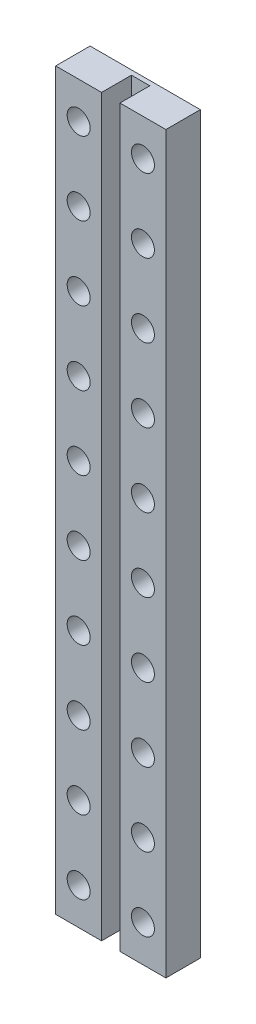
ISO-10303-21;
HEADER;
FILE_DESCRIPTION(('STEP AP214'),'2;1');
FILE_NAME('part.step','',(''),(''),'','','');
FILE_SCHEMA(('AUTOMOTIVE_DESIGN { 1 0 10303 214 1 1 1 1 }'));
ENDSEC;
DATA;
#1=APPLICATION_CONTEXT('core data for automotive mechanical design processes');
#2=APPLICATION_PROTOCOL_DEFINITION('international standard','automotive_design',2000,#1);
#3=PRODUCT_CONTEXT('',#1,'mechanical');
#4=PRODUCT('Part','Part','',(#3));
#5=PRODUCT_RELATED_PRODUCT_CATEGORY('part','',(#4));
#6=PRODUCT_DEFINITION_FORMATION('','',#4);
#7=PRODUCT_DEFINITION_CONTEXT('part definition',#1,'design');
#8=PRODUCT_DEFINITION('design','',#6,#7);
#9=PRODUCT_DEFINITION_SHAPE('','',#8);
#10=(LENGTH_UNIT() NAMED_UNIT(*) SI_UNIT(.MILLI.,.METRE.));
#11=(NAMED_UNIT(*) PLANE_ANGLE_UNIT() SI_UNIT($,.RADIAN.));
#12=(NAMED_UNIT(*) SI_UNIT($,.STERADIAN.) SOLID_ANGLE_UNIT());
#13=UNCERTAINTY_MEASURE_WITH_UNIT(LENGTH_MEASURE(1.E-05),#10,'distance_accuracy_value','');
#14=(GEOMETRIC_REPRESENTATION_CONTEXT(3) GLOBAL_UNCERTAINTY_ASSIGNED_CONTEXT((#13)) GLOBAL_UNIT_ASSIGNED_CONTEXT((#10,
#11,#12)) REPRESENTATION_CONTEXT('',''));
#15=CARTESIAN_POINT('',(0.,0.,0.));
#16=DIRECTION('',(0.,0.,1.));
#17=DIRECTION('',(1.,0.,0.));
#18=AXIS2_PLACEMENT_3D('',#15,#16,#17);
#19=CARTESIAN_POINT('',(-2.,-160.,3.75));
#20=DIRECTION('',(0.,0.,1.));
#21=DIRECTION('',(1.,0.,0.));
#22=AXIS2_PLACEMENT_3D('',#19,#20,#21);
#23=PLANE('',#22);
#24=CARTESIAN_POINT('',(-6.99999999999849,-152.,3.75));
#25=DIRECTION('',(0.,0.,1.));
#26=DIRECTION('',(1.,0.,0.));
#27=AXIS2_PLACEMENT_3D('',#24,#25,#26);
#28=CIRCLE('',#27,2.5);
#29=CARTESIAN_POINT('',(-4.49999999999849,-152.,3.75));
#30=VERTEX_POINT('',#29);
#31=EDGE_CURVE('E284',#30,#30,#28,.T.);
#32=ORIENTED_EDGE('',*,*,#31,.F.);
#33=EDGE_LOOP('',(#32));
#34=FACE_BOUND('',#33,.T.);
#35=CARTESIAN_POINT('',(-6.99999999999866,-136.,3.75));
#36=DIRECTION('',(0.,0.,1.));
#37=DIRECTION('',(1.,0.,0.));
#38=AXIS2_PLACEMENT_3D('',#35,#36,#37);
#39=CIRCLE('',#38,2.5);
#40=CARTESIAN_POINT('',(-4.49999999999866,-136.,3.75));
#41=VERTEX_POINT('',#40);
#42=EDGE_CURVE('E286',#41,#41,#39,.T.);
#43=ORIENTED_EDGE('',*,*,#42,.F.);
#44=EDGE_LOOP('',(#43));
#45=FACE_BOUND('',#44,.T.);
#46=CARTESIAN_POINT('',(-6.99999999999882,-120.,3.75));
#47=DIRECTION('',(0.,0.,1.));
#48=DIRECTION('',(1.,0.,0.));
#49=AXIS2_PLACEMENT_3D('',#46,#47,#48);
#50=CIRCLE('',#49,2.5);
#51=CARTESIAN_POINT('',(-4.49999999999883,-120.,3.75));
#52=VERTEX_POINT('',#51);
#53=EDGE_CURVE('E292',#52,#52,#50,.T.);
#54=ORIENTED_EDGE('',*,*,#53,.F.);
#55=EDGE_LOOP('',(#54));
#56=FACE_BOUND('',#55,.T.);
#57=CARTESIAN_POINT('',(-6.99999999999899,-104.,3.75));
#58=DIRECTION('',(0.,0.,1.));
#59=DIRECTION('',(1.,0.,0.));
#60=AXIS2_PLACEMENT_3D('',#57,#58,#59);
#61=CIRCLE('',#60,2.5);
#62=CARTESIAN_POINT('',(-4.49999999999899,-104.,3.75));
#63=VERTEX_POINT('',#62);
#64=EDGE_CURVE('E298',#63,#63,#61,.T.);
#65=ORIENTED_EDGE('',*,*,#64,.F.);
#66=EDGE_LOOP('',(#65));
#67=FACE_BOUND('',#66,.T.);
#68=CARTESIAN_POINT('',(-6.99999999999916,-88.,3.75));
#69=DIRECTION('',(0.,0.,1.));
#70=DIRECTION('',(1.,0.,0.));
#71=AXIS2_PLACEMENT_3D('',#68,#69,#70);
#72=CIRCLE('',#71,2.5);
#73=CARTESIAN_POINT('',(-4.49999999999916,-88.,3.75));
#74=VERTEX_POINT('',#73);
#75=EDGE_CURVE('E304',#74,#74,#72,.T.);
#76=ORIENTED_EDGE('',*,*,#75,.F.);
#77=EDGE_LOOP('',(#76));
#78=FACE_BOUND('',#77,.T.);
#79=CARTESIAN_POINT('',(-6.99999999999933,-72.,3.75));
#80=DIRECTION('',(0.,0.,1.));
#81=DIRECTION('',(1.,0.,0.));
#82=AXIS2_PLACEMENT_3D('',#79,#80,#81);
#83=CIRCLE('',#82,2.5);
#84=CARTESIAN_POINT('',(-4.49999999999933,-72.,3.75));
#85=VERTEX_POINT('',#84);
#86=EDGE_CURVE('E310',#85,#85,#83,.T.);
#87=ORIENTED_EDGE('',*,*,#86,.F.);
#88=EDGE_LOOP('',(#87));
#89=FACE_BOUND('',#88,.T.);
#90=CARTESIAN_POINT('',(-6.99999999999949,-56.,3.75));
#91=DIRECTION('',(0.,0.,1.));
#92=DIRECTION('',(1.,0.,0.));
#93=AXIS2_PLACEMENT_3D('',#90,#91,#92);
#94=CIRCLE('',#93,2.5);
#95=CARTESIAN_POINT('',(-4.49999999999949,-56.,3.75));
#96=VERTEX_POINT('',#95);
#97=EDGE_CURVE('E316',#96,#96,#94,.T.);
#98=ORIENTED_EDGE('',*,*,#97,.F.);
#99=EDGE_LOOP('',(#98));
#100=FACE_BOUND('',#99,.T.);
#101=CARTESIAN_POINT('',(-6.99999999999966,-40.,3.75));
#102=DIRECTION('',(0.,0.,1.));
#103=DIRECTION('',(1.,0.,0.));
#104=AXIS2_PLACEMENT_3D('',#101,#102,#103);
#105=CIRCLE('',#104,2.5);
#106=CARTESIAN_POINT('',(-4.49999999999966,-40.,3.75));
#107=VERTEX_POINT('',#106);
#108=EDGE_CURVE('E322',#107,#107,#105,.T.);
#109=ORIENTED_EDGE('',*,*,#108,.F.);
#110=EDGE_LOOP('',(#109));
#111=FACE_BOUND('',#110,.T.);
#112=CARTESIAN_POINT('',(-6.99999999999983,-24.,3.75));
#113=DIRECTION('',(0.,0.,1.));
#114=DIRECTION('',(1.,0.,0.));
#115=AXIS2_PLACEMENT_3D('',#112,#113,#114);
#116=CIRCLE('',#115,2.5);
#117=CARTESIAN_POINT('',(-4.49999999999983,-24.,3.75));
#118=VERTEX_POINT('',#117);
#119=EDGE_CURVE('E328',#118,#118,#116,.T.);
#120=ORIENTED_EDGE('',*,*,#119,.F.);
#121=EDGE_LOOP('',(#120));
#122=FACE_BOUND('',#121,.T.);
#123=CARTESIAN_POINT('',(-7.,-8.,3.75));
#124=DIRECTION('',(0.,0.,1.));
#125=DIRECTION('',(1.,0.,0.));
#126=AXIS2_PLACEMENT_3D('',#123,#124,#125);
#127=CIRCLE('',#126,2.5);
#128=CARTESIAN_POINT('',(-4.5,-8.,3.75));
#129=VERTEX_POINT('',#128);
#130=EDGE_CURVE('E394',#129,#129,#127,.T.);
#131=ORIENTED_EDGE('',*,*,#130,.F.);
#132=EDGE_LOOP('',(#131));
#133=FACE_BOUND('',#132,.T.);
#134=DIRECTION('',(1.,0.,0.));
#135=VECTOR('',#134,1.);
#136=CARTESIAN_POINT('',(-2.,0.,3.75));
#137=LINE('',#136,#135);
#138=CARTESIAN_POINT('',(-12.,0.,3.75));
#139=VERTEX_POINT('',#138);
#140=CARTESIAN_POINT('',(-2.,0.,3.75));
#141=VERTEX_POINT('',#140);
#142=EDGE_CURVE('E130',#139,#141,#137,.T.);
#143=ORIENTED_EDGE('',*,*,#142,.F.);
#144=DIRECTION('',(0.,1.,0.));
#145=VECTOR('',#144,1.);
#146=CARTESIAN_POINT('',(-12.,-160.,3.75));
#147=LINE('',#146,#145);
#148=CARTESIAN_POINT('',(-12.,-160.,3.75));
#149=VERTEX_POINT('',#148);
#150=EDGE_CURVE('E11',#149,#139,#147,.T.);
#151=ORIENTED_EDGE('',*,*,#150,.F.);
#152=DIRECTION('',(1.,0.,0.));
#153=VECTOR('',#152,1.);
#154=CARTESIAN_POINT('',(-2.,-160.,3.75));
#155=LINE('',#154,#153);
#156=CARTESIAN_POINT('',(-2.,-160.,3.75));
#157=VERTEX_POINT('',#156);
#158=EDGE_CURVE('E151',#149,#157,#155,.T.);
#159=ORIENTED_EDGE('',*,*,#158,.T.);
#160=DIRECTION('',(0.,1.,0.));
#161=VECTOR('',#160,1.);
#162=CARTESIAN_POINT('',(-2.,-160.,3.75));
#163=LINE('',#162,#161);
#164=EDGE_CURVE('E36',#157,#141,#163,.T.);
#165=ORIENTED_EDGE('',*,*,#164,.T.);
#166=EDGE_LOOP('',(#143,#151,#159,#165));
#167=FACE_BOUND('',#166,.T.);
#168=ADVANCED_FACE('F33',(#34,#45,#56,#67,#78,#89,#100,#111,#122,#133,#167),#23,.T.);
#169=CARTESIAN_POINT('',(-12.,-160.,-3.75));
#170=DIRECTION('',(-1.,0.,0.));
#171=DIRECTION('',(0.,0.,1.));
#172=AXIS2_PLACEMENT_3D('',#169,#170,#171);
#173=PLANE('',#172);
#174=DIRECTION('',(0.,0.,1.));
#175=VECTOR('',#174,1.);
#176=CARTESIAN_POINT('',(-12.,0.,-3.75));
#177=LINE('',#176,#175);
#178=CARTESIAN_POINT('',(-12.,0.,-3.75));
#179=VERTEX_POINT('',#178);
#180=EDGE_CURVE('E149',#179,#139,#177,.T.);
#181=ORIENTED_EDGE('',*,*,#180,.F.);
#182=DIRECTION('',(0.,1.,0.));
#183=VECTOR('',#182,1.);
#184=CARTESIAN_POINT('',(-12.,-160.,-3.75));
#185=LINE('',#184,#183);
#186=CARTESIAN_POINT('',(-12.,-160.,-3.75));
#187=VERTEX_POINT('',#186);
#188=EDGE_CURVE('E42',#187,#179,#185,.T.);
#189=ORIENTED_EDGE('',*,*,#188,.F.);
#190=DIRECTION('',(0.,0.,1.));
#191=VECTOR('',#190,1.);
#192=CARTESIAN_POINT('',(-12.,-160.,-3.75));
#193=LINE('',#192,#191);
#194=EDGE_CURVE('E120',#187,#149,#193,.T.);
#195=ORIENTED_EDGE('',*,*,#194,.T.);
#196=ORIENTED_EDGE('',*,*,#150,.T.);
#197=EDGE_LOOP('',(#181,#189,#195,#196));
#198=FACE_BOUND('',#197,.T.);
#199=ADVANCED_FACE('F163',(#198),#173,.T.);
#200=CARTESIAN_POINT('',(12.,-160.,-3.75));
#201=DIRECTION('',(0.,0.,-1.));
#202=DIRECTION('',(-1.,0.,0.));
#203=AXIS2_PLACEMENT_3D('',#200,#201,#202);
#204=PLANE('',#203);
#205=CARTESIAN_POINT('',(-6.99999999999849,-152.,-3.75));
#206=DIRECTION('',(0.,0.,1.));
#207=DIRECTION('',(1.,0.,0.));
#208=AXIS2_PLACEMENT_3D('',#205,#206,#207);
#209=CIRCLE('',#208,2.5);
#210=CARTESIAN_POINT('',(-4.49999999999849,-152.,-3.75));
#211=VERTEX_POINT('',#210);
#212=EDGE_CURVE('E281',#211,#211,#209,.T.);
#213=ORIENTED_EDGE('',*,*,#212,.T.);
#214=EDGE_LOOP('',(#213));
#215=FACE_BOUND('',#214,.T.);
#216=CARTESIAN_POINT('',(-6.99999999999866,-136.,-3.75));
#217=DIRECTION('',(0.,0.,1.));
#218=DIRECTION('',(1.,0.,0.));
#219=AXIS2_PLACEMENT_3D('',#216,#217,#218);
#220=CIRCLE('',#219,2.5);
#221=CARTESIAN_POINT('',(-4.49999999999866,-136.,-3.75));
#222=VERTEX_POINT('',#221);
#223=EDGE_CURVE('E289',#222,#222,#220,.T.);
#224=ORIENTED_EDGE('',*,*,#223,.T.);
#225=EDGE_LOOP('',(#224));
#226=FACE_BOUND('',#225,.T.);
#227=CARTESIAN_POINT('',(-6.99999999999882,-120.,-3.75));
#228=DIRECTION('',(0.,0.,1.));
#229=DIRECTION('',(1.,0.,0.));
#230=AXIS2_PLACEMENT_3D('',#227,#228,#229);
#231=CIRCLE('',#230,2.5);
#232=CARTESIAN_POINT('',(-4.49999999999883,-120.,-3.75));
#233=VERTEX_POINT('',#232);
#234=EDGE_CURVE('E295',#233,#233,#231,.T.);
#235=ORIENTED_EDGE('',*,*,#234,.T.);
#236=EDGE_LOOP('',(#235));
#237=FACE_BOUND('',#236,.T.);
#238=CARTESIAN_POINT('',(-6.99999999999899,-104.,-3.75));
#239=DIRECTION('',(0.,0.,1.));
#240=DIRECTION('',(1.,0.,0.));
#241=AXIS2_PLACEMENT_3D('',#238,#239,#240);
#242=CIRCLE('',#241,2.5);
#243=CARTESIAN_POINT('',(-4.49999999999899,-104.,-3.75));
#244=VERTEX_POINT('',#243);
#245=EDGE_CURVE('E301',#244,#244,#242,.T.);
#246=ORIENTED_EDGE('',*,*,#245,.T.);
#247=EDGE_LOOP('',(#246));
#248=FACE_BOUND('',#247,.T.);
#249=CARTESIAN_POINT('',(-6.99999999999916,-88.,-3.75));
#250=DIRECTION('',(0.,0.,1.));
#251=DIRECTION('',(1.,0.,0.));
#252=AXIS2_PLACEMENT_3D('',#249,#250,#251);
#253=CIRCLE('',#252,2.5);
#254=CARTESIAN_POINT('',(-4.49999999999916,-88.,-3.75));
#255=VERTEX_POINT('',#254);
#256=EDGE_CURVE('E307',#255,#255,#253,.T.);
#257=ORIENTED_EDGE('',*,*,#256,.T.);
#258=EDGE_LOOP('',(#257));
#259=FACE_BOUND('',#258,.T.);
#260=CARTESIAN_POINT('',(-6.99999999999933,-72.,-3.75));
#261=DIRECTION('',(0.,0.,1.));
#262=DIRECTION('',(1.,0.,0.));
#263=AXIS2_PLACEMENT_3D('',#260,#261,#262);
#264=CIRCLE('',#263,2.5);
#265=CARTESIAN_POINT('',(-4.49999999999933,-72.,-3.75));
#266=VERTEX_POINT('',#265);
#267=EDGE_CURVE('E313',#266,#266,#264,.T.);
#268=ORIENTED_EDGE('',*,*,#267,.T.);
#269=EDGE_LOOP('',(#268));
#270=FACE_BOUND('',#269,.T.);
#271=CARTESIAN_POINT('',(-6.99999999999949,-56.,-3.75));
#272=DIRECTION('',(0.,0.,1.));
#273=DIRECTION('',(1.,0.,0.));
#274=AXIS2_PLACEMENT_3D('',#271,#272,#273);
#275=CIRCLE('',#274,2.5);
#276=CARTESIAN_POINT('',(-4.49999999999949,-56.,-3.75));
#277=VERTEX_POINT('',#276);
#278=EDGE_CURVE('E319',#277,#277,#275,.T.);
#279=ORIENTED_EDGE('',*,*,#278,.T.);
#280=EDGE_LOOP('',(#279));
#281=FACE_BOUND('',#280,.T.);
#282=CARTESIAN_POINT('',(-6.99999999999966,-40.,-3.75));
#283=DIRECTION('',(0.,0.,1.));
#284=DIRECTION('',(1.,0.,0.));
#285=AXIS2_PLACEMENT_3D('',#282,#283,#284);
#286=CIRCLE('',#285,2.5);
#287=CARTESIAN_POINT('',(-4.49999999999966,-40.,-3.75));
#288=VERTEX_POINT('',#287);
#289=EDGE_CURVE('E325',#288,#288,#286,.T.);
#290=ORIENTED_EDGE('',*,*,#289,.T.);
#291=EDGE_LOOP('',(#290));
#292=FACE_BOUND('',#291,.T.);
#293=CARTESIAN_POINT('',(-6.99999999999983,-24.,-3.75));
#294=DIRECTION('',(0.,0.,1.));
#295=DIRECTION('',(1.,0.,0.));
#296=AXIS2_PLACEMENT_3D('',#293,#294,#295);
#297=CIRCLE('',#296,2.5);
#298=CARTESIAN_POINT('',(-4.49999999999983,-24.,-3.75));
#299=VERTEX_POINT('',#298);
#300=EDGE_CURVE('E331',#299,#299,#297,.T.);
#301=ORIENTED_EDGE('',*,*,#300,.T.);
#302=EDGE_LOOP('',(#301));
#303=FACE_BOUND('',#302,.T.);
#304=CARTESIAN_POINT('',(7.00000000000151,-152.,-3.75));
#305=DIRECTION('',(0.,0.,1.));
#306=DIRECTION('',(1.,0.,0.));
#307=AXIS2_PLACEMENT_3D('',#304,#305,#306);
#308=CIRCLE('',#307,2.5);
#309=CARTESIAN_POINT('',(9.50000000000151,-152.,-3.75));
#310=VERTEX_POINT('',#309);
#311=EDGE_CURVE('E337',#310,#310,#308,.T.);
#312=ORIENTED_EDGE('',*,*,#311,.T.);
#313=EDGE_LOOP('',(#312));
#314=FACE_BOUND('',#313,.T.);
#315=CARTESIAN_POINT('',(7.00000000000134,-136.,-3.75));
#316=DIRECTION('',(0.,0.,1.));
#317=DIRECTION('',(1.,0.,0.));
#318=AXIS2_PLACEMENT_3D('',#315,#316,#317);
#319=CIRCLE('',#318,2.5);
#320=CARTESIAN_POINT('',(9.50000000000134,-136.,-3.75));
#321=VERTEX_POINT('',#320);
#322=EDGE_CURVE('E343',#321,#321,#319,.T.);
#323=ORIENTED_EDGE('',*,*,#322,.T.);
#324=EDGE_LOOP('',(#323));
#325=FACE_BOUND('',#324,.T.);
#326=CARTESIAN_POINT('',(7.00000000000118,-120.,-3.75));
#327=DIRECTION('',(0.,0.,1.));
#328=DIRECTION('',(1.,0.,0.));
#329=AXIS2_PLACEMENT_3D('',#326,#327,#328);
#330=CIRCLE('',#329,2.5);
#331=CARTESIAN_POINT('',(9.50000000000117,-120.,-3.75));
#332=VERTEX_POINT('',#331);
#333=EDGE_CURVE('E349',#332,#332,#330,.T.);
#334=ORIENTED_EDGE('',*,*,#333,.T.);
#335=EDGE_LOOP('',(#334));
#336=FACE_BOUND('',#335,.T.);
#337=CARTESIAN_POINT('',(7.00000000000101,-104.,-3.75));
#338=DIRECTION('',(0.,0.,1.));
#339=DIRECTION('',(1.,0.,0.));
#340=AXIS2_PLACEMENT_3D('',#337,#338,#339);
#341=CIRCLE('',#340,2.5);
#342=CARTESIAN_POINT('',(9.50000000000101,-104.,-3.75));
#343=VERTEX_POINT('',#342);
#344=EDGE_CURVE('E355',#343,#343,#341,.T.);
#345=ORIENTED_EDGE('',*,*,#344,.T.);
#346=EDGE_LOOP('',(#345));
#347=FACE_BOUND('',#346,.T.);
#348=CARTESIAN_POINT('',(7.00000000000084,-88.,-3.75));
#349=DIRECTION('',(0.,0.,1.));
#350=DIRECTION('',(1.,0.,0.));
#351=AXIS2_PLACEMENT_3D('',#348,#349,#350);
#352=CIRCLE('',#351,2.5);
#353=CARTESIAN_POINT('',(9.50000000000084,-88.,-3.75));
#354=VERTEX_POINT('',#353);
#355=EDGE_CURVE('E361',#354,#354,#352,.T.);
#356=ORIENTED_EDGE('',*,*,#355,.T.);
#357=EDGE_LOOP('',(#356));
#358=FACE_BOUND('',#357,.T.);
#359=CARTESIAN_POINT('',(7.00000000000067,-72.,-3.75));
#360=DIRECTION('',(0.,0.,1.));
#361=DIRECTION('',(1.,0.,0.));
#362=AXIS2_PLACEMENT_3D('',#359,#360,#361);
#363=CIRCLE('',#362,2.5);
#364=CARTESIAN_POINT('',(9.50000000000067,-72.,-3.75));
#365=VERTEX_POINT('',#364);
#366=EDGE_CURVE('E367',#365,#365,#363,.T.);
#367=ORIENTED_EDGE('',*,*,#366,.T.);
#368=EDGE_LOOP('',(#367));
#369=FACE_BOUND('',#368,.T.);
#370=CARTESIAN_POINT('',(7.00000000000051,-56.,-3.75));
#371=DIRECTION('',(0.,0.,1.));
#372=DIRECTION('',(1.,0.,0.));
#373=AXIS2_PLACEMENT_3D('',#370,#371,#372);
#374=CIRCLE('',#373,2.5);
#375=CARTESIAN_POINT('',(9.5000000000005,-56.,-3.75));
#376=VERTEX_POINT('',#375);
#377=EDGE_CURVE('E373',#376,#376,#374,.T.);
#378=ORIENTED_EDGE('',*,*,#377,.T.);
#379=EDGE_LOOP('',(#378));
#380=FACE_BOUND('',#379,.T.);
#381=CARTESIAN_POINT('',(7.00000000000034,-40.,-3.75));
#382=DIRECTION('',(0.,0.,1.));
#383=DIRECTION('',(1.,0.,0.));
#384=AXIS2_PLACEMENT_3D('',#381,#382,#383);
#385=CIRCLE('',#384,2.5);
#386=CARTESIAN_POINT('',(9.50000000000034,-40.,-3.75));
#387=VERTEX_POINT('',#386);
#388=EDGE_CURVE('E379',#387,#387,#385,.T.);
#389=ORIENTED_EDGE('',*,*,#388,.T.);
#390=EDGE_LOOP('',(#389));
#391=FACE_BOUND('',#390,.T.);
#392=CARTESIAN_POINT('',(7.00000000000017,-24.,-3.75));
#393=DIRECTION('',(0.,0.,1.));
#394=DIRECTION('',(1.,0.,0.));
#395=AXIS2_PLACEMENT_3D('',#392,#393,#394);
#396=CIRCLE('',#395,2.5);
#397=CARTESIAN_POINT('',(9.50000000000017,-24.,-3.75));
#398=VERTEX_POINT('',#397);
#399=EDGE_CURVE('E385',#398,#398,#396,.T.);
#400=ORIENTED_EDGE('',*,*,#399,.T.);
#401=EDGE_LOOP('',(#400));
#402=FACE_BOUND('',#401,.T.);
#403=CARTESIAN_POINT('',(7.,-8.,-3.75));
#404=DIRECTION('',(0.,0.,1.));
#405=DIRECTION('',(1.,0.,0.));
#406=AXIS2_PLACEMENT_3D('',#403,#404,#405);
#407=CIRCLE('',#406,2.5);
#408=CARTESIAN_POINT('',(9.5,-8.,-3.75));
#409=VERTEX_POINT('',#408);
#410=EDGE_CURVE('E391',#409,#409,#407,.T.);
#411=ORIENTED_EDGE('',*,*,#410,.T.);
#412=EDGE_LOOP('',(#411));
#413=FACE_BOUND('',#412,.T.);
#414=CARTESIAN_POINT('',(-7.,-8.,-3.75));
#415=DIRECTION('',(0.,0.,1.));
#416=DIRECTION('',(1.,0.,0.));
#417=AXIS2_PLACEMENT_3D('',#414,#415,#416);
#418=CIRCLE('',#417,2.5);
#419=CARTESIAN_POINT('',(-4.5,-8.,-3.75));
#420=VERTEX_POINT('',#419);
#421=EDGE_CURVE('E134',#420,#420,#418,.T.);
#422=ORIENTED_EDGE('',*,*,#421,.T.);
#423=EDGE_LOOP('',(#422));
#424=FACE_BOUND('',#423,.T.);
#425=DIRECTION('',(-1.,0.,0.));
#426=VECTOR('',#425,1.);
#427=CARTESIAN_POINT('',(12.,0.,-3.75));
#428=LINE('',#427,#426);
#429=CARTESIAN_POINT('',(12.,0.,-3.75));
#430=VERTEX_POINT('',#429);
#431=EDGE_CURVE('E107',#430,#179,#428,.T.);
#432=ORIENTED_EDGE('',*,*,#431,.F.);
#433=DIRECTION('',(0.,1.,0.));
#434=VECTOR('',#433,1.);
#435=CARTESIAN_POINT('',(12.,-160.,-3.75));
#436=LINE('',#435,#434);
#437=CARTESIAN_POINT('',(12.,-160.,-3.75));
#438=VERTEX_POINT('',#437);
#439=EDGE_CURVE('E102',#438,#430,#436,.T.);
#440=ORIENTED_EDGE('',*,*,#439,.F.);
#441=DIRECTION('',(-1.,0.,0.));
#442=VECTOR('',#441,1.);
#443=CARTESIAN_POINT('',(12.,-160.,-3.75));
#444=LINE('',#443,#442);
#445=EDGE_CURVE('E105',#438,#187,#444,.T.);
#446=ORIENTED_EDGE('',*,*,#445,.T.);
#447=ORIENTED_EDGE('',*,*,#188,.T.);
#448=EDGE_LOOP('',(#432,#440,#446,#447));
#449=FACE_BOUND('',#448,.T.);
#450=ADVANCED_FACE('F104',(#215,#226,#237,#248,#259,#270,#281,#292,#303,#314,#325,#336,#347,
#358,#369,#380,#391,#402,#413,#424,#449),#204,.T.);
#451=CARTESIAN_POINT('',(12.,-160.,-3.75));
#452=DIRECTION('',(1.,0.,0.));
#453=DIRECTION('',(0.,0.,-1.));
#454=AXIS2_PLACEMENT_3D('',#451,#452,#453);
#455=PLANE('',#454);
#456=DIRECTION('',(0.,0.,-1.));
#457=VECTOR('',#456,1.);
#458=CARTESIAN_POINT('',(12.,0.,-3.75));
#459=LINE('',#458,#457);
#460=CARTESIAN_POINT('',(12.,0.,3.75));
#461=VERTEX_POINT('',#460);
#462=EDGE_CURVE('E146',#461,#430,#459,.T.);
#463=ORIENTED_EDGE('',*,*,#462,.F.);
#464=DIRECTION('',(0.,1.,0.));
#465=VECTOR('',#464,1.);
#466=CARTESIAN_POINT('',(12.,-160.,3.75));
#467=LINE('',#466,#465);
#468=CARTESIAN_POINT('',(12.,-160.,3.75));
#469=VERTEX_POINT('',#468);
#470=EDGE_CURVE('E112',#469,#461,#467,.T.);
#471=ORIENTED_EDGE('',*,*,#470,.F.);
#472=DIRECTION('',(0.,0.,-1.));
#473=VECTOR('',#472,1.);
#474=CARTESIAN_POINT('',(12.,-160.,-3.75));
#475=LINE('',#474,#473);
#476=EDGE_CURVE('E118',#469,#438,#475,.T.);
#477=ORIENTED_EDGE('',*,*,#476,.T.);
#478=ORIENTED_EDGE('',*,*,#439,.T.);
#479=EDGE_LOOP('',(#463,#471,#477,#478));
#480=FACE_BOUND('',#479,.T.);
#481=ADVANCED_FACE('F122',(#480),#455,.T.);
#482=CARTESIAN_POINT('',(12.,-160.,3.75));
#483=DIRECTION('',(0.,0.,1.));
#484=DIRECTION('',(1.,0.,0.));
#485=AXIS2_PLACEMENT_3D('',#482,#483,#484);
#486=PLANE('',#485);
#487=CARTESIAN_POINT('',(7.00000000000151,-152.,3.75));
#488=DIRECTION('',(0.,0.,1.));
#489=DIRECTION('',(1.,0.,0.));
#490=AXIS2_PLACEMENT_3D('',#487,#488,#489);
#491=CIRCLE('',#490,2.5);
#492=CARTESIAN_POINT('',(9.50000000000151,-152.,3.75));
#493=VERTEX_POINT('',#492);
#494=EDGE_CURVE('E334',#493,#493,#491,.T.);
#495=ORIENTED_EDGE('',*,*,#494,.F.);
#496=EDGE_LOOP('',(#495));
#497=FACE_BOUND('',#496,.T.);
#498=CARTESIAN_POINT('',(7.00000000000134,-136.,3.75));
#499=DIRECTION('',(0.,0.,1.));
#500=DIRECTION('',(1.,0.,0.));
#501=AXIS2_PLACEMENT_3D('',#498,#499,#500);
#502=CIRCLE('',#501,2.5);
#503=CARTESIAN_POINT('',(9.50000000000134,-136.,3.75));
#504=VERTEX_POINT('',#503);
#505=EDGE_CURVE('E340',#504,#504,#502,.T.);
#506=ORIENTED_EDGE('',*,*,#505,.F.);
#507=EDGE_LOOP('',(#506));
#508=FACE_BOUND('',#507,.T.);
#509=CARTESIAN_POINT('',(7.00000000000118,-120.,3.75));
#510=DIRECTION('',(0.,0.,1.));
#511=DIRECTION('',(1.,0.,0.));
#512=AXIS2_PLACEMENT_3D('',#509,#510,#511);
#513=CIRCLE('',#512,2.5);
#514=CARTESIAN_POINT('',(9.50000000000117,-120.,3.75));
#515=VERTEX_POINT('',#514);
#516=EDGE_CURVE('E346',#515,#515,#513,.T.);
#517=ORIENTED_EDGE('',*,*,#516,.F.);
#518=EDGE_LOOP('',(#517));
#519=FACE_BOUND('',#518,.T.);
#520=CARTESIAN_POINT('',(7.00000000000101,-104.,3.75));
#521=DIRECTION('',(0.,0.,1.));
#522=DIRECTION('',(1.,0.,0.));
#523=AXIS2_PLACEMENT_3D('',#520,#521,#522);
#524=CIRCLE('',#523,2.5);
#525=CARTESIAN_POINT('',(9.50000000000101,-104.,3.75));
#526=VERTEX_POINT('',#525);
#527=EDGE_CURVE('E352',#526,#526,#524,.T.);
#528=ORIENTED_EDGE('',*,*,#527,.F.);
#529=EDGE_LOOP('',(#528));
#530=FACE_BOUND('',#529,.T.);
#531=CARTESIAN_POINT('',(7.00000000000084,-88.,3.75));
#532=DIRECTION('',(0.,0.,1.));
#533=DIRECTION('',(1.,0.,0.));
#534=AXIS2_PLACEMENT_3D('',#531,#532,#533);
#535=CIRCLE('',#534,2.5);
#536=CARTESIAN_POINT('',(9.50000000000084,-88.,3.75));
#537=VERTEX_POINT('',#536);
#538=EDGE_CURVE('E358',#537,#537,#535,.T.);
#539=ORIENTED_EDGE('',*,*,#538,.F.);
#540=EDGE_LOOP('',(#539));
#541=FACE_BOUND('',#540,.T.);
#542=CARTESIAN_POINT('',(7.00000000000067,-72.,3.75));
#543=DIRECTION('',(0.,0.,1.));
#544=DIRECTION('',(1.,0.,0.));
#545=AXIS2_PLACEMENT_3D('',#542,#543,#544);
#546=CIRCLE('',#545,2.5);
#547=CARTESIAN_POINT('',(9.50000000000067,-72.,3.75));
#548=VERTEX_POINT('',#547);
#549=EDGE_CURVE('E364',#548,#548,#546,.T.);
#550=ORIENTED_EDGE('',*,*,#549,.F.);
#551=EDGE_LOOP('',(#550));
#552=FACE_BOUND('',#551,.T.);
#553=CARTESIAN_POINT('',(7.00000000000051,-56.,3.75));
#554=DIRECTION('',(0.,0.,1.));
#555=DIRECTION('',(1.,0.,0.));
#556=AXIS2_PLACEMENT_3D('',#553,#554,#555);
#557=CIRCLE('',#556,2.5);
#558=CARTESIAN_POINT('',(9.5000000000005,-56.,3.75));
#559=VERTEX_POINT('',#558);
#560=EDGE_CURVE('E370',#559,#559,#557,.T.);
#561=ORIENTED_EDGE('',*,*,#560,.F.);
#562=EDGE_LOOP('',(#561));
#563=FACE_BOUND('',#562,.T.);
#564=CARTESIAN_POINT('',(7.00000000000034,-40.,3.75));
#565=DIRECTION('',(0.,0.,1.));
#566=DIRECTION('',(1.,0.,0.));
#567=AXIS2_PLACEMENT_3D('',#564,#565,#566);
#568=CIRCLE('',#567,2.5);
#569=CARTESIAN_POINT('',(9.50000000000034,-40.,3.75));
#570=VERTEX_POINT('',#569);
#571=EDGE_CURVE('E376',#570,#570,#568,.T.);
#572=ORIENTED_EDGE('',*,*,#571,.F.);
#573=EDGE_LOOP('',(#572));
#574=FACE_BOUND('',#573,.T.);
#575=CARTESIAN_POINT('',(7.00000000000017,-24.,3.75));
#576=DIRECTION('',(0.,0.,1.));
#577=DIRECTION('',(1.,0.,0.));
#578=AXIS2_PLACEMENT_3D('',#575,#576,#577);
#579=CIRCLE('',#578,2.5);
#580=CARTESIAN_POINT('',(9.50000000000017,-24.,3.75));
#581=VERTEX_POINT('',#580);
#582=EDGE_CURVE('E382',#581,#581,#579,.T.);
#583=ORIENTED_EDGE('',*,*,#582,.F.);
#584=EDGE_LOOP('',(#583));
#585=FACE_BOUND('',#584,.T.);
#586=CARTESIAN_POINT('',(7.,-8.,3.75));
#587=DIRECTION('',(0.,0.,1.));
#588=DIRECTION('',(1.,0.,0.));
#589=AXIS2_PLACEMENT_3D('',#586,#587,#588);
#590=CIRCLE('',#589,2.5);
#591=CARTESIAN_POINT('',(9.5,-8.,3.75));
#592=VERTEX_POINT('',#591);
#593=EDGE_CURVE('E388',#592,#592,#590,.T.);
#594=ORIENTED_EDGE('',*,*,#593,.F.);
#595=EDGE_LOOP('',(#594));
#596=FACE_BOUND('',#595,.T.);
#597=DIRECTION('',(1.,0.,0.));
#598=VECTOR('',#597,1.);
#599=CARTESIAN_POINT('',(12.,0.,3.75));
#600=LINE('',#599,#598);
#601=CARTESIAN_POINT('',(2.,0.,3.75));
#602=VERTEX_POINT('',#601);
#603=EDGE_CURVE('E143',#602,#461,#600,.T.);
#604=ORIENTED_EDGE('',*,*,#603,.F.);
#605=DIRECTION('',(0.,1.,0.));
#606=VECTOR('',#605,1.);
#607=CARTESIAN_POINT('',(2.,-160.,3.75));
#608=LINE('',#607,#606);
#609=CARTESIAN_POINT('',(2.,-160.,3.75));
#610=VERTEX_POINT('',#609);
#611=EDGE_CURVE('E155',#610,#602,#608,.T.);
#612=ORIENTED_EDGE('',*,*,#611,.F.);
#613=DIRECTION('',(1.,0.,0.));
#614=VECTOR('',#613,1.);
#615=CARTESIAN_POINT('',(12.,-160.,3.75));
#616=LINE('',#615,#614);
#617=EDGE_CURVE('E123',#610,#469,#616,.T.);
#618=ORIENTED_EDGE('',*,*,#617,.T.);
#619=ORIENTED_EDGE('',*,*,#470,.T.);
#620=EDGE_LOOP('',(#604,#612,#618,#619));
#621=FACE_BOUND('',#620,.T.);
#622=ADVANCED_FACE('F178',(#497,#508,#519,#530,#541,#552,#563,#574,#585,#596,#621),#486,.T.);
#623=CARTESIAN_POINT('',(2.,-160.,-2.75));
#624=DIRECTION('',(-1.,0.,0.));
#625=DIRECTION('',(0.,0.,1.));
#626=AXIS2_PLACEMENT_3D('',#623,#624,#625);
#627=PLANE('',#626);
#628=DIRECTION('',(0.,0.,1.));
#629=VECTOR('',#628,1.);
#630=CARTESIAN_POINT('',(2.,0.,-2.75));
#631=LINE('',#630,#629);
#632=CARTESIAN_POINT('',(2.,0.,-2.75));
#633=VERTEX_POINT('',#632);
#634=EDGE_CURVE('E140',#633,#602,#631,.T.);
#635=ORIENTED_EDGE('',*,*,#634,.F.);
#636=DIRECTION('',(0.,1.,0.));
#637=VECTOR('',#636,1.);
#638=CARTESIAN_POINT('',(2.,-160.,-2.75));
#639=LINE('',#638,#637);
#640=CARTESIAN_POINT('',(2.,-160.,-2.75));
#641=VERTEX_POINT('',#640);
#642=EDGE_CURVE('E157',#641,#633,#639,.T.);
#643=ORIENTED_EDGE('',*,*,#642,.F.);
#644=DIRECTION('',(0.,0.,1.));
#645=VECTOR('',#644,1.);
#646=CARTESIAN_POINT('',(2.,-160.,-2.75));
#647=LINE('',#646,#645);
#648=EDGE_CURVE('E125',#641,#610,#647,.T.);
#649=ORIENTED_EDGE('',*,*,#648,.T.);
#650=ORIENTED_EDGE('',*,*,#611,.T.);
#651=EDGE_LOOP('',(#635,#643,#649,#650));
#652=FACE_BOUND('',#651,.T.);
#653=ADVANCED_FACE('F181',(#652),#627,.T.);
#654=CARTESIAN_POINT('',(-2.,-160.,-2.75));
#655=DIRECTION('',(0.,0.,1.));
#656=DIRECTION('',(1.,0.,0.));
#657=AXIS2_PLACEMENT_3D('',#654,#655,#656);
#658=PLANE('',#657);
#659=DIRECTION('',(1.,0.,0.));
#660=VECTOR('',#659,1.);
#661=CARTESIAN_POINT('',(-2.,0.,-2.75));
#662=LINE('',#661,#660);
#663=CARTESIAN_POINT('',(-2.,0.,-2.75));
#664=VERTEX_POINT('',#663);
#665=EDGE_CURVE('E137',#664,#633,#662,.T.);
#666=ORIENTED_EDGE('',*,*,#665,.F.);
#667=DIRECTION('',(0.,1.,0.));
#668=VECTOR('',#667,1.);
#669=CARTESIAN_POINT('',(-2.,-160.,-2.75));
#670=LINE('',#669,#668);
#671=CARTESIAN_POINT('',(-2.,-160.,-2.75));
#672=VERTEX_POINT('',#671);
#673=EDGE_CURVE('E158',#672,#664,#670,.T.);
#674=ORIENTED_EDGE('',*,*,#673,.F.);
#675=DIRECTION('',(1.,0.,0.));
#676=VECTOR('',#675,1.);
#677=CARTESIAN_POINT('',(-2.,-160.,-2.75));
#678=LINE('',#677,#676);
#679=EDGE_CURVE('E404',#672,#641,#678,.T.);
#680=ORIENTED_EDGE('',*,*,#679,.T.);
#681=ORIENTED_EDGE('',*,*,#642,.T.);
#682=EDGE_LOOP('',(#666,#674,#680,#681));
#683=FACE_BOUND('',#682,.T.);
#684=ADVANCED_FACE('F185',(#683),#658,.T.);
#685=CARTESIAN_POINT('',(-2.,-160.,3.75));
#686=DIRECTION('',(1.,0.,0.));
#687=DIRECTION('',(0.,0.,-1.));
#688=AXIS2_PLACEMENT_3D('',#685,#686,#687);
#689=PLANE('',#688);
#690=DIRECTION('',(0.,0.,-1.));
#691=VECTOR('',#690,1.);
#692=CARTESIAN_POINT('',(-2.,0.,3.75));
#693=LINE('',#692,#691);
#694=EDGE_CURVE('E133',#141,#664,#693,.T.);
#695=ORIENTED_EDGE('',*,*,#694,.F.);
#696=ORIENTED_EDGE('',*,*,#164,.F.);
#697=DIRECTION('',(0.,0.,-1.));
#698=VECTOR('',#697,1.);
#699=CARTESIAN_POINT('',(-2.,-160.,3.75));
#700=LINE('',#699,#698);
#701=EDGE_CURVE('E402',#157,#672,#700,.T.);
#702=ORIENTED_EDGE('',*,*,#701,.T.);
#703=ORIENTED_EDGE('',*,*,#673,.T.);
#704=EDGE_LOOP('',(#695,#696,#702,#703));
#705=FACE_BOUND('',#704,.T.);
#706=ADVANCED_FACE('F160',(#705),#689,.T.);
#707=CARTESIAN_POINT('',(0.,-160.,0.));
#708=DIRECTION('',(0.,1.,0.));
#709=DIRECTION('',(0.,0.,1.));
#710=AXIS2_PLACEMENT_3D('',#707,#708,#709);
#711=PLANE('',#710);
#712=ORIENTED_EDGE('',*,*,#158,.F.);
#713=ORIENTED_EDGE('',*,*,#194,.F.);
#714=ORIENTED_EDGE('',*,*,#445,.F.);
#715=ORIENTED_EDGE('',*,*,#476,.F.);
#716=ORIENTED_EDGE('',*,*,#617,.F.);
#717=ORIENTED_EDGE('',*,*,#648,.F.);
#718=ORIENTED_EDGE('',*,*,#679,.F.);
#719=ORIENTED_EDGE('',*,*,#701,.F.);
#720=EDGE_LOOP('',(#712,#713,#714,#715,#716,#717,#718,#719));
#721=FACE_BOUND('',#720,.T.);
#722=ADVANCED_FACE('F116',(#721),#711,.F.);
#723=CARTESIAN_POINT('',(0.,0.,0.));
#724=DIRECTION('',(0.,1.,0.));
#725=DIRECTION('',(0.,0.,1.));
#726=AXIS2_PLACEMENT_3D('',#723,#724,#725);
#727=PLANE('',#726);
#728=ORIENTED_EDGE('',*,*,#142,.T.);
#729=ORIENTED_EDGE('',*,*,#694,.T.);
#730=ORIENTED_EDGE('',*,*,#665,.T.);
#731=ORIENTED_EDGE('',*,*,#634,.T.);
#732=ORIENTED_EDGE('',*,*,#603,.T.);
#733=ORIENTED_EDGE('',*,*,#462,.T.);
#734=ORIENTED_EDGE('',*,*,#431,.T.);
#735=ORIENTED_EDGE('',*,*,#180,.T.);
#736=EDGE_LOOP('',(#728,#729,#730,#731,#732,#733,#734,#735));
#737=FACE_BOUND('',#736,.T.);
#738=ADVANCED_FACE('F162',(#737),#727,.T.);
#739=CARTESIAN_POINT('',(-7.,-8.,-3.75));
#740=DIRECTION('',(0.,0.,1.));
#741=DIRECTION('',(1.,0.,0.));
#742=AXIS2_PLACEMENT_3D('',#739,#740,#741);
#743=CYLINDRICAL_SURFACE('',#742,2.5);
#744=ORIENTED_EDGE('',*,*,#421,.F.);
#745=EDGE_LOOP('',(#744));
#746=FACE_BOUND('',#745,.T.);
#747=ORIENTED_EDGE('',*,*,#130,.T.);
#748=EDGE_LOOP('',(#747));
#749=FACE_BOUND('',#748,.T.);
#750=ADVANCED_FACE('F196',(#746,#749),#743,.F.);
#751=CARTESIAN_POINT('',(7.,-8.,-3.75));
#752=DIRECTION('',(0.,0.,1.));
#753=DIRECTION('',(1.,0.,0.));
#754=AXIS2_PLACEMENT_3D('',#751,#752,#753);
#755=CYLINDRICAL_SURFACE('',#754,2.5);
#756=ORIENTED_EDGE('',*,*,#410,.F.);
#757=EDGE_LOOP('',(#756));
#758=FACE_BOUND('',#757,.T.);
#759=ORIENTED_EDGE('',*,*,#593,.T.);
#760=EDGE_LOOP('',(#759));
#761=FACE_BOUND('',#760,.T.);
#762=ADVANCED_FACE('F200',(#758,#761),#755,.F.);
#763=CARTESIAN_POINT('',(7.00000000000017,-24.,-3.75));
#764=DIRECTION('',(0.,0.,1.));
#765=DIRECTION('',(1.,0.,0.));
#766=AXIS2_PLACEMENT_3D('',#763,#764,#765);
#767=CYLINDRICAL_SURFACE('',#766,2.5);
#768=ORIENTED_EDGE('',*,*,#399,.F.);
#769=EDGE_LOOP('',(#768));
#770=FACE_BOUND('',#769,.T.);
#771=ORIENTED_EDGE('',*,*,#582,.T.);
#772=EDGE_LOOP('',(#771));
#773=FACE_BOUND('',#772,.T.);
#774=ADVANCED_FACE('F204',(#770,#773),#767,.F.);
#775=CARTESIAN_POINT('',(7.00000000000034,-40.,-3.75));
#776=DIRECTION('',(0.,0.,1.));
#777=DIRECTION('',(1.,0.,0.));
#778=AXIS2_PLACEMENT_3D('',#775,#776,#777);
#779=CYLINDRICAL_SURFACE('',#778,2.5);
#780=ORIENTED_EDGE('',*,*,#388,.F.);
#781=EDGE_LOOP('',(#780));
#782=FACE_BOUND('',#781,.T.);
#783=ORIENTED_EDGE('',*,*,#571,.T.);
#784=EDGE_LOOP('',(#783));
#785=FACE_BOUND('',#784,.T.);
#786=ADVANCED_FACE('F208',(#782,#785),#779,.F.);
#787=CARTESIAN_POINT('',(7.00000000000051,-56.,-3.75));
#788=DIRECTION('',(0.,0.,1.));
#789=DIRECTION('',(1.,0.,0.));
#790=AXIS2_PLACEMENT_3D('',#787,#788,#789);
#791=CYLINDRICAL_SURFACE('',#790,2.5);
#792=ORIENTED_EDGE('',*,*,#377,.F.);
#793=EDGE_LOOP('',(#792));
#794=FACE_BOUND('',#793,.T.);
#795=ORIENTED_EDGE('',*,*,#560,.T.);
#796=EDGE_LOOP('',(#795));
#797=FACE_BOUND('',#796,.T.);
#798=ADVANCED_FACE('F212',(#794,#797),#791,.F.);
#799=CARTESIAN_POINT('',(7.00000000000067,-72.,-3.75));
#800=DIRECTION('',(0.,0.,1.));
#801=DIRECTION('',(1.,0.,0.));
#802=AXIS2_PLACEMENT_3D('',#799,#800,#801);
#803=CYLINDRICAL_SURFACE('',#802,2.5);
#804=ORIENTED_EDGE('',*,*,#366,.F.);
#805=EDGE_LOOP('',(#804));
#806=FACE_BOUND('',#805,.T.);
#807=ORIENTED_EDGE('',*,*,#549,.T.);
#808=EDGE_LOOP('',(#807));
#809=FACE_BOUND('',#808,.T.);
#810=ADVANCED_FACE('F216',(#806,#809),#803,.F.);
#811=CARTESIAN_POINT('',(7.00000000000084,-88.,-3.75));
#812=DIRECTION('',(0.,0.,1.));
#813=DIRECTION('',(1.,0.,0.));
#814=AXIS2_PLACEMENT_3D('',#811,#812,#813);
#815=CYLINDRICAL_SURFACE('',#814,2.5);
#816=ORIENTED_EDGE('',*,*,#355,.F.);
#817=EDGE_LOOP('',(#816));
#818=FACE_BOUND('',#817,.T.);
#819=ORIENTED_EDGE('',*,*,#538,.T.);
#820=EDGE_LOOP('',(#819));
#821=FACE_BOUND('',#820,.T.);
#822=ADVANCED_FACE('F220',(#818,#821),#815,.F.);
#823=CARTESIAN_POINT('',(7.00000000000101,-104.,-3.75));
#824=DIRECTION('',(0.,0.,1.));
#825=DIRECTION('',(1.,0.,0.));
#826=AXIS2_PLACEMENT_3D('',#823,#824,#825);
#827=CYLINDRICAL_SURFACE('',#826,2.5);
#828=ORIENTED_EDGE('',*,*,#344,.F.);
#829=EDGE_LOOP('',(#828));
#830=FACE_BOUND('',#829,.T.);
#831=ORIENTED_EDGE('',*,*,#527,.T.);
#832=EDGE_LOOP('',(#831));
#833=FACE_BOUND('',#832,.T.);
#834=ADVANCED_FACE('F224',(#830,#833),#827,.F.);
#835=CARTESIAN_POINT('',(7.00000000000118,-120.,-3.75));
#836=DIRECTION('',(0.,0.,1.));
#837=DIRECTION('',(1.,0.,0.));
#838=AXIS2_PLACEMENT_3D('',#835,#836,#837);
#839=CYLINDRICAL_SURFACE('',#838,2.5);
#840=ORIENTED_EDGE('',*,*,#333,.F.);
#841=EDGE_LOOP('',(#840));
#842=FACE_BOUND('',#841,.T.);
#843=ORIENTED_EDGE('',*,*,#516,.T.);
#844=EDGE_LOOP('',(#843));
#845=FACE_BOUND('',#844,.T.);
#846=ADVANCED_FACE('F228',(#842,#845),#839,.F.);
#847=CARTESIAN_POINT('',(7.00000000000134,-136.,-3.75));
#848=DIRECTION('',(0.,0.,1.));
#849=DIRECTION('',(1.,0.,0.));
#850=AXIS2_PLACEMENT_3D('',#847,#848,#849);
#851=CYLINDRICAL_SURFACE('',#850,2.5);
#852=ORIENTED_EDGE('',*,*,#322,.F.);
#853=EDGE_LOOP('',(#852));
#854=FACE_BOUND('',#853,.T.);
#855=ORIENTED_EDGE('',*,*,#505,.T.);
#856=EDGE_LOOP('',(#855));
#857=FACE_BOUND('',#856,.T.);
#858=ADVANCED_FACE('F232',(#854,#857),#851,.F.);
#859=CARTESIAN_POINT('',(7.00000000000151,-152.,-3.75));
#860=DIRECTION('',(0.,0.,1.));
#861=DIRECTION('',(1.,0.,0.));
#862=AXIS2_PLACEMENT_3D('',#859,#860,#861);
#863=CYLINDRICAL_SURFACE('',#862,2.5);
#864=ORIENTED_EDGE('',*,*,#311,.F.);
#865=EDGE_LOOP('',(#864));
#866=FACE_BOUND('',#865,.T.);
#867=ORIENTED_EDGE('',*,*,#494,.T.);
#868=EDGE_LOOP('',(#867));
#869=FACE_BOUND('',#868,.T.);
#870=ADVANCED_FACE('F236',(#866,#869),#863,.F.);
#871=CARTESIAN_POINT('',(-6.99999999999983,-24.,-3.75));
#872=DIRECTION('',(0.,0.,1.));
#873=DIRECTION('',(1.,0.,0.));
#874=AXIS2_PLACEMENT_3D('',#871,#872,#873);
#875=CYLINDRICAL_SURFACE('',#874,2.5);
#876=ORIENTED_EDGE('',*,*,#300,.F.);
#877=EDGE_LOOP('',(#876));
#878=FACE_BOUND('',#877,.T.);
#879=ORIENTED_EDGE('',*,*,#119,.T.);
#880=EDGE_LOOP('',(#879));
#881=FACE_BOUND('',#880,.T.);
#882=ADVANCED_FACE('F240',(#878,#881),#875,.F.);
#883=CARTESIAN_POINT('',(-6.99999999999966,-40.,-3.75));
#884=DIRECTION('',(0.,0.,1.));
#885=DIRECTION('',(1.,0.,0.));
#886=AXIS2_PLACEMENT_3D('',#883,#884,#885);
#887=CYLINDRICAL_SURFACE('',#886,2.5);
#888=ORIENTED_EDGE('',*,*,#289,.F.);
#889=EDGE_LOOP('',(#888));
#890=FACE_BOUND('',#889,.T.);
#891=ORIENTED_EDGE('',*,*,#108,.T.);
#892=EDGE_LOOP('',(#891));
#893=FACE_BOUND('',#892,.T.);
#894=ADVANCED_FACE('F244',(#890,#893),#887,.F.);
#895=CARTESIAN_POINT('',(-6.99999999999949,-56.,-3.75));
#896=DIRECTION('',(0.,0.,1.));
#897=DIRECTION('',(1.,0.,0.));
#898=AXIS2_PLACEMENT_3D('',#895,#896,#897);
#899=CYLINDRICAL_SURFACE('',#898,2.5);
#900=ORIENTED_EDGE('',*,*,#278,.F.);
#901=EDGE_LOOP('',(#900));
#902=FACE_BOUND('',#901,.T.);
#903=ORIENTED_EDGE('',*,*,#97,.T.);
#904=EDGE_LOOP('',(#903));
#905=FACE_BOUND('',#904,.T.);
#906=ADVANCED_FACE('F248',(#902,#905),#899,.F.);
#907=CARTESIAN_POINT('',(-6.99999999999933,-72.,-3.75));
#908=DIRECTION('',(0.,0.,1.));
#909=DIRECTION('',(1.,0.,0.));
#910=AXIS2_PLACEMENT_3D('',#907,#908,#909);
#911=CYLINDRICAL_SURFACE('',#910,2.5);
#912=ORIENTED_EDGE('',*,*,#267,.F.);
#913=EDGE_LOOP('',(#912));
#914=FACE_BOUND('',#913,.T.);
#915=ORIENTED_EDGE('',*,*,#86,.T.);
#916=EDGE_LOOP('',(#915));
#917=FACE_BOUND('',#916,.T.);
#918=ADVANCED_FACE('F252',(#914,#917),#911,.F.);
#919=CARTESIAN_POINT('',(-6.99999999999916,-88.,-3.75));
#920=DIRECTION('',(0.,0.,1.));
#921=DIRECTION('',(1.,0.,0.));
#922=AXIS2_PLACEMENT_3D('',#919,#920,#921);
#923=CYLINDRICAL_SURFACE('',#922,2.5);
#924=ORIENTED_EDGE('',*,*,#256,.F.);
#925=EDGE_LOOP('',(#924));
#926=FACE_BOUND('',#925,.T.);
#927=ORIENTED_EDGE('',*,*,#75,.T.);
#928=EDGE_LOOP('',(#927));
#929=FACE_BOUND('',#928,.T.);
#930=ADVANCED_FACE('F256',(#926,#929),#923,.F.);
#931=CARTESIAN_POINT('',(-6.99999999999899,-104.,-3.75));
#932=DIRECTION('',(0.,0.,1.));
#933=DIRECTION('',(1.,0.,0.));
#934=AXIS2_PLACEMENT_3D('',#931,#932,#933);
#935=CYLINDRICAL_SURFACE('',#934,2.5);
#936=ORIENTED_EDGE('',*,*,#245,.F.);
#937=EDGE_LOOP('',(#936));
#938=FACE_BOUND('',#937,.T.);
#939=ORIENTED_EDGE('',*,*,#64,.T.);
#940=EDGE_LOOP('',(#939));
#941=FACE_BOUND('',#940,.T.);
#942=ADVANCED_FACE('F260',(#938,#941),#935,.F.);
#943=CARTESIAN_POINT('',(-6.99999999999882,-120.,-3.75));
#944=DIRECTION('',(0.,0.,1.));
#945=DIRECTION('',(1.,0.,0.));
#946=AXIS2_PLACEMENT_3D('',#943,#944,#945);
#947=CYLINDRICAL_SURFACE('',#946,2.5);
#948=ORIENTED_EDGE('',*,*,#234,.F.);
#949=EDGE_LOOP('',(#948));
#950=FACE_BOUND('',#949,.T.);
#951=ORIENTED_EDGE('',*,*,#53,.T.);
#952=EDGE_LOOP('',(#951));
#953=FACE_BOUND('',#952,.T.);
#954=ADVANCED_FACE('F264',(#950,#953),#947,.F.);
#955=CARTESIAN_POINT('',(-6.99999999999866,-136.,-3.75));
#956=DIRECTION('',(0.,0.,1.));
#957=DIRECTION('',(1.,0.,0.));
#958=AXIS2_PLACEMENT_3D('',#955,#956,#957);
#959=CYLINDRICAL_SURFACE('',#958,2.5);
#960=ORIENTED_EDGE('',*,*,#223,.F.);
#961=EDGE_LOOP('',(#960));
#962=FACE_BOUND('',#961,.T.);
#963=ORIENTED_EDGE('',*,*,#42,.T.);
#964=EDGE_LOOP('',(#963));
#965=FACE_BOUND('',#964,.T.);
#966=ADVANCED_FACE('F268',(#962,#965),#959,.F.);
#967=CARTESIAN_POINT('',(-6.99999999999849,-152.,-3.75));
#968=DIRECTION('',(0.,0.,1.));
#969=DIRECTION('',(1.,0.,0.));
#970=AXIS2_PLACEMENT_3D('',#967,#968,#969);
#971=CYLINDRICAL_SURFACE('',#970,2.5);
#972=ORIENTED_EDGE('',*,*,#212,.F.);
#973=EDGE_LOOP('',(#972));
#974=FACE_BOUND('',#973,.T.);
#975=ORIENTED_EDGE('',*,*,#31,.T.);
#976=EDGE_LOOP('',(#975));
#977=FACE_BOUND('',#976,.T.);
#978=ADVANCED_FACE('F272',(#974,#977),#971,.F.);
#979=CLOSED_SHELL('',(#168,#199,#450,#481,#622,#653,#684,#706,#722,#738,#750,#762,#774,#786,
#798,#810,#822,#834,#846,#858,#870,#882,#894,#906,#918,#930,#942,#954,#966,#978));
#980=MANIFOLD_SOLID_BREP('B2',#979);
#981=ADVANCED_BREP_SHAPE_REPRESENTATION('',(#18,#980),#14);
#982=SHAPE_DEFINITION_REPRESENTATION(#9,#981);
ENDSEC;
END-ISO-10303-21;
